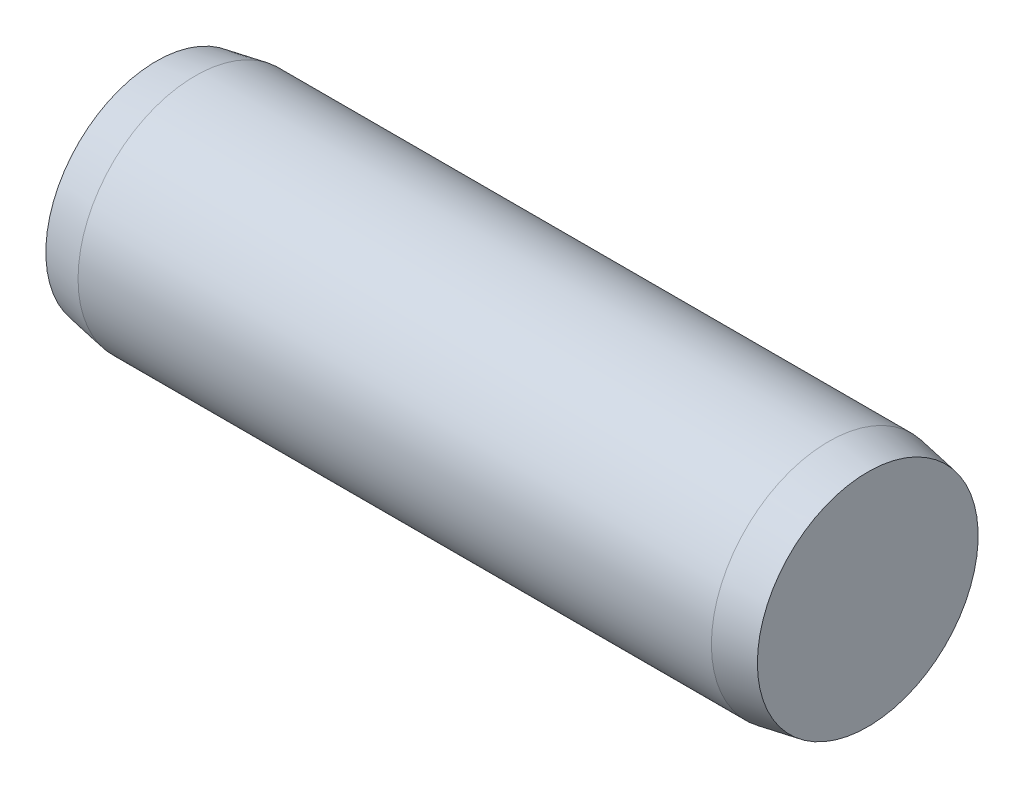
ISO-10303-21;
HEADER;
FILE_DESCRIPTION(('STEP AP214'),'2;1');
FILE_NAME('part.step','',(''),(''),'','','');
FILE_SCHEMA(('AUTOMOTIVE_DESIGN { 1 0 10303 214 1 1 1 1 }'));
ENDSEC;
DATA;
#1=APPLICATION_CONTEXT('core data for automotive mechanical design processes');
#2=APPLICATION_PROTOCOL_DEFINITION('international standard','automotive_design',2000,#1);
#3=PRODUCT_CONTEXT('',#1,'mechanical');
#4=PRODUCT('Part','Part','',(#3));
#5=PRODUCT_RELATED_PRODUCT_CATEGORY('part','',(#4));
#6=PRODUCT_DEFINITION_FORMATION('','',#4);
#7=PRODUCT_DEFINITION_CONTEXT('part definition',#1,'design');
#8=PRODUCT_DEFINITION('design','',#6,#7);
#9=PRODUCT_DEFINITION_SHAPE('','',#8);
#10=(LENGTH_UNIT() NAMED_UNIT(*) SI_UNIT(.MILLI.,.METRE.));
#11=(NAMED_UNIT(*) PLANE_ANGLE_UNIT() SI_UNIT($,.RADIAN.));
#12=(NAMED_UNIT(*) SI_UNIT($,.STERADIAN.) SOLID_ANGLE_UNIT());
#13=UNCERTAINTY_MEASURE_WITH_UNIT(LENGTH_MEASURE(1.E-05),#10,'distance_accuracy_value','');
#14=(GEOMETRIC_REPRESENTATION_CONTEXT(3) GLOBAL_UNCERTAINTY_ASSIGNED_CONTEXT((#13)) GLOBAL_UNIT_ASSIGNED_CONTEXT((#10,
#11,#12)) REPRESENTATION_CONTEXT('',''));
#15=CARTESIAN_POINT('',(0.,0.,0.));
#16=DIRECTION('',(0.,0.,1.));
#17=DIRECTION('',(1.,0.,0.));
#18=AXIS2_PLACEMENT_3D('',#15,#16,#17);
#19=CARTESIAN_POINT('',(0.,0.,0.));
#20=DIRECTION('',(-1.,0.,0.));
#21=DIRECTION('',(0.,0.,1.));
#22=AXIS2_PLACEMENT_3D('',#19,#20,#21);
#23=PLANE('',#22);
#24=CARTESIAN_POINT('',(-1.12436282506678E-07,0.,0.));
#25=DIRECTION('',(-1.,0.,0.));
#26=DIRECTION('',(0.,0.,1.));
#27=AXIS2_PLACEMENT_3D('',#24,#25,#26);
#28=CIRCLE('',#27,1.41183540243617);
#29=CARTESIAN_POINT('',(-1.12436282506678E-07,0.,1.41183540243617));
#30=VERTEX_POINT('',#29);
#31=EDGE_CURVE('E18',#30,#30,#28,.T.);
#32=ORIENTED_EDGE('',*,*,#31,.F.);
#33=EDGE_LOOP('',(#32));
#34=FACE_BOUND('',#33,.T.);
#35=ADVANCED_FACE('F15',(#34),#23,.F.);
#36=CARTESIAN_POINT('',(-9.1,0.,0.));
#37=DIRECTION('',(-1.,0.,0.));
#38=DIRECTION('',(0.,0.,1.));
#39=AXIS2_PLACEMENT_3D('',#36,#37,#38);
#40=PLANE('',#39);
#41=CARTESIAN_POINT('',(-9.0999999520136,0.,0.));
#42=DIRECTION('',(1.,0.,0.));
#43=DIRECTION('',(0.,0.,-1.));
#44=AXIS2_PLACEMENT_3D('',#41,#42,#43);
#45=CIRCLE('',#44,1.41183565741316);
#46=CARTESIAN_POINT('',(-9.0999999520136,0.,-1.41183565741316));
#47=VERTEX_POINT('',#46);
#48=EDGE_CURVE('E27',#47,#47,#45,.T.);
#49=ORIENTED_EDGE('',*,*,#48,.F.);
#50=EDGE_LOOP('',(#49));
#51=FACE_BOUND('',#50,.T.);
#52=ADVANCED_FACE('F38',(#51),#40,.T.);
#53=CARTESIAN_POINT('',(-0.500002837952707,0.,0.));
#54=DIRECTION('',(-1.,0.,0.));
#55=DIRECTION('',(0.,0.,1.));
#56=AXIS2_PLACEMENT_3D('',#53,#54,#55);
#57=CONICAL_SURFACE('',#56,1.49999930300737,0.174532788713487);
#58=CARTESIAN_POINT('',(-0.5000028379384,0.,0.));
#59=DIRECTION('',(-1.,0.,0.));
#60=DIRECTION('',(0.,0.,1.));
#61=AXIS2_PLACEMENT_3D('',#58,#59,#60);
#62=CIRCLE('',#61,1.5);
#63=CARTESIAN_POINT('',(-0.5000028379384,0.,1.5));
#64=VERTEX_POINT('',#63);
#65=EDGE_CURVE('E22',#64,#64,#62,.T.);
#66=ORIENTED_EDGE('',*,*,#65,.F.);
#67=EDGE_LOOP('',(#66));
#68=FACE_BOUND('',#67,.T.);
#69=ORIENTED_EDGE('',*,*,#31,.T.);
#70=EDGE_LOOP('',(#69));
#71=FACE_BOUND('',#70,.T.);
#72=ADVANCED_FACE('F35',(#68,#71),#57,.T.);
#73=CARTESIAN_POINT('',(-8.59999649162546,0.,0.));
#74=DIRECTION('',(1.,0.,0.));
#75=DIRECTION('',(0.,0.,-1.));
#76=AXIS2_PLACEMENT_3D('',#73,#74,#75);
#77=CONICAL_SURFACE('',#76,1.4999997041798,0.174532820946747);
#78=CARTESIAN_POINT('',(-8.59999649147,0.,0.));
#79=DIRECTION('',(-1.,0.,0.));
#80=DIRECTION('',(0.,0.,1.));
#81=AXIS2_PLACEMENT_3D('',#78,#79,#80);
#82=CIRCLE('',#81,1.5);
#83=CARTESIAN_POINT('',(-8.59999649147,0.,1.5));
#84=VERTEX_POINT('',#83);
#85=EDGE_CURVE('E10',#84,#84,#82,.F.);
#86=ORIENTED_EDGE('',*,*,#85,.F.);
#87=EDGE_LOOP('',(#86));
#88=FACE_BOUND('',#87,.T.);
#89=ORIENTED_EDGE('',*,*,#48,.T.);
#90=EDGE_LOOP('',(#89));
#91=FACE_BOUND('',#90,.T.);
#92=ADVANCED_FACE('F46',(#88,#91),#77,.T.);
#93=CARTESIAN_POINT('',(0.455,0.,0.));
#94=DIRECTION('',(-1.,0.,0.));
#95=DIRECTION('',(0.,0.,1.));
#96=AXIS2_PLACEMENT_3D('',#93,#94,#95);
#97=CYLINDRICAL_SURFACE('',#96,1.5);
#98=ORIENTED_EDGE('',*,*,#85,.T.);
#99=EDGE_LOOP('',(#98));
#100=FACE_BOUND('',#99,.T.);
#101=ORIENTED_EDGE('',*,*,#65,.T.);
#102=EDGE_LOOP('',(#101));
#103=FACE_BOUND('',#102,.T.);
#104=ADVANCED_FACE('F44',(#100,#103),#97,.T.);
#105=CLOSED_SHELL('',(#35,#52,#72,#92,#104));
#106=MANIFOLD_SOLID_BREP('B1',#105);
#107=ADVANCED_BREP_SHAPE_REPRESENTATION('',(#18,#106),#14);
#108=SHAPE_DEFINITION_REPRESENTATION(#9,#107);
ENDSEC;
END-ISO-10303-21;
